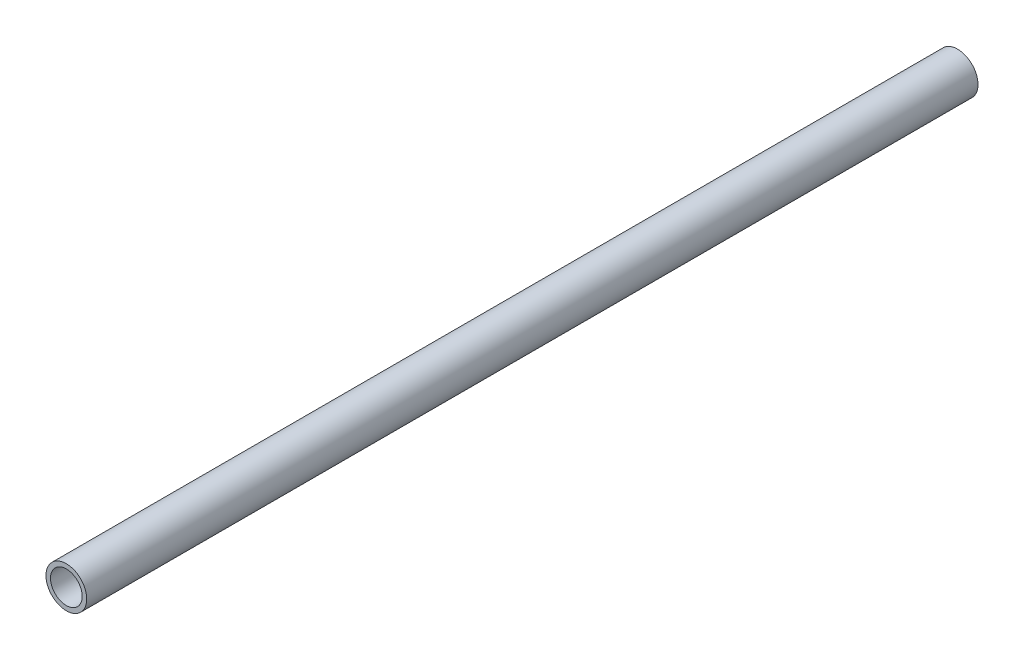
ISO-10303-21;
HEADER;
FILE_DESCRIPTION(('STEP AP214'),'2;1');
FILE_NAME('part.step','',(''),(''),'','','');
FILE_SCHEMA(('AUTOMOTIVE_DESIGN { 1 0 10303 214 1 1 1 1 }'));
ENDSEC;
DATA;
#1=APPLICATION_CONTEXT('core data for automotive mechanical design processes');
#2=APPLICATION_PROTOCOL_DEFINITION('international standard','automotive_design',2000,#1);
#3=PRODUCT_CONTEXT('',#1,'mechanical');
#4=PRODUCT('Part','Part','',(#3));
#5=PRODUCT_RELATED_PRODUCT_CATEGORY('part','',(#4));
#6=PRODUCT_DEFINITION_FORMATION('','',#4);
#7=PRODUCT_DEFINITION_CONTEXT('part definition',#1,'design');
#8=PRODUCT_DEFINITION('design','',#6,#7);
#9=PRODUCT_DEFINITION_SHAPE('','',#8);
#10=(LENGTH_UNIT() NAMED_UNIT(*) SI_UNIT(.MILLI.,.METRE.));
#11=(NAMED_UNIT(*) PLANE_ANGLE_UNIT() SI_UNIT($,.RADIAN.));
#12=(NAMED_UNIT(*) SI_UNIT($,.STERADIAN.) SOLID_ANGLE_UNIT());
#13=UNCERTAINTY_MEASURE_WITH_UNIT(LENGTH_MEASURE(1.E-05),#10,'distance_accuracy_value','');
#14=(GEOMETRIC_REPRESENTATION_CONTEXT(3) GLOBAL_UNCERTAINTY_ASSIGNED_CONTEXT((#13)) GLOBAL_UNIT_ASSIGNED_CONTEXT((#10,
#11,#12)) REPRESENTATION_CONTEXT('',''));
#15=CARTESIAN_POINT('',(0.,0.,0.));
#16=DIRECTION('',(0.,0.,1.));
#17=DIRECTION('',(1.,0.,0.));
#18=AXIS2_PLACEMENT_3D('',#15,#16,#17);
#19=CARTESIAN_POINT('',(0.,0.,393.37));
#20=DIRECTION('',(0.,0.,1.));
#21=DIRECTION('',(1.,0.,0.));
#22=AXIS2_PLACEMENT_3D('',#19,#20,#21);
#23=PLANE('',#22);
#24=CARTESIAN_POINT('',(0.,0.,393.37));
#25=DIRECTION('',(0.,0.,1.));
#26=DIRECTION('',(1.,0.,0.));
#27=AXIS2_PLACEMENT_3D('',#24,#25,#26);
#28=CIRCLE('',#27,9.);
#29=CARTESIAN_POINT('',(9.,0.,393.37));
#30=VERTEX_POINT('',#29);
#31=EDGE_CURVE('E10',#30,#30,#28,.T.);
#32=ORIENTED_EDGE('',*,*,#31,.T.);
#33=EDGE_LOOP('',(#32));
#34=FACE_BOUND('',#33,.T.);
#35=CARTESIAN_POINT('',(0.,0.,393.37));
#36=DIRECTION('',(0.,0.,1.));
#37=DIRECTION('',(1.,0.,0.));
#38=AXIS2_PLACEMENT_3D('',#35,#36,#37);
#39=CIRCLE('',#38,7.);
#40=CARTESIAN_POINT('',(7.,0.,393.37));
#41=VERTEX_POINT('',#40);
#42=EDGE_CURVE('E50',#41,#41,#39,.T.);
#43=ORIENTED_EDGE('',*,*,#42,.F.);
#44=EDGE_LOOP('',(#43));
#45=FACE_BOUND('',#44,.T.);
#46=ADVANCED_FACE('F36',(#34,#45),#23,.T.);
#47=CARTESIAN_POINT('',(0.,0.,0.));
#48=DIRECTION('',(0.,0.,1.));
#49=DIRECTION('',(1.,0.,0.));
#50=AXIS2_PLACEMENT_3D('',#47,#48,#49);
#51=PLANE('',#50);
#52=CARTESIAN_POINT('',(0.,0.,0.));
#53=DIRECTION('',(0.,0.,1.));
#54=DIRECTION('',(1.,0.,0.));
#55=AXIS2_PLACEMENT_3D('',#52,#53,#54);
#56=CIRCLE('',#55,9.);
#57=CARTESIAN_POINT('',(9.,0.,0.));
#58=VERTEX_POINT('',#57);
#59=EDGE_CURVE('E40',#58,#58,#56,.T.);
#60=ORIENTED_EDGE('',*,*,#59,.F.);
#61=EDGE_LOOP('',(#60));
#62=FACE_BOUND('',#61,.T.);
#63=CARTESIAN_POINT('',(0.,0.,0.));
#64=DIRECTION('',(0.,0.,1.));
#65=DIRECTION('',(1.,0.,0.));
#66=AXIS2_PLACEMENT_3D('',#63,#64,#65);
#67=CIRCLE('',#66,7.);
#68=CARTESIAN_POINT('',(7.,0.,0.));
#69=VERTEX_POINT('',#68);
#70=EDGE_CURVE('E52',#69,#69,#67,.T.);
#71=ORIENTED_EDGE('',*,*,#70,.T.);
#72=EDGE_LOOP('',(#71));
#73=FACE_BOUND('',#72,.T.);
#74=ADVANCED_FACE('F63',(#62,#73),#51,.F.);
#75=CARTESIAN_POINT('',(0.,0.,393.37));
#76=DIRECTION('',(0.,0.,-1.));
#77=DIRECTION('',(-1.,0.,0.));
#78=AXIS2_PLACEMENT_3D('',#75,#76,#77);
#79=CYLINDRICAL_SURFACE('',#78,9.);
#80=ORIENTED_EDGE('',*,*,#31,.F.);
#81=EDGE_LOOP('',(#80));
#82=FACE_BOUND('',#81,.T.);
#83=ORIENTED_EDGE('',*,*,#59,.T.);
#84=EDGE_LOOP('',(#83));
#85=FACE_BOUND('',#84,.T.);
#86=ADVANCED_FACE('F38',(#82,#85),#79,.T.);
#87=CARTESIAN_POINT('',(0.,0.,393.37));
#88=DIRECTION('',(0.,0.,-1.));
#89=DIRECTION('',(-1.,0.,0.));
#90=AXIS2_PLACEMENT_3D('',#87,#88,#89);
#91=CYLINDRICAL_SURFACE('',#90,7.);
#92=ORIENTED_EDGE('',*,*,#42,.T.);
#93=EDGE_LOOP('',(#92));
#94=FACE_BOUND('',#93,.T.);
#95=ORIENTED_EDGE('',*,*,#70,.F.);
#96=EDGE_LOOP('',(#95));
#97=FACE_BOUND('',#96,.T.);
#98=ADVANCED_FACE('F59',(#94,#97),#91,.F.);
#99=CLOSED_SHELL('',(#46,#74,#86,#98));
#100=MANIFOLD_SOLID_BREP('B2',#99);
#101=ADVANCED_BREP_SHAPE_REPRESENTATION('',(#18,#100),#14);
#102=SHAPE_DEFINITION_REPRESENTATION(#9,#101);
ENDSEC;
END-ISO-10303-21;
